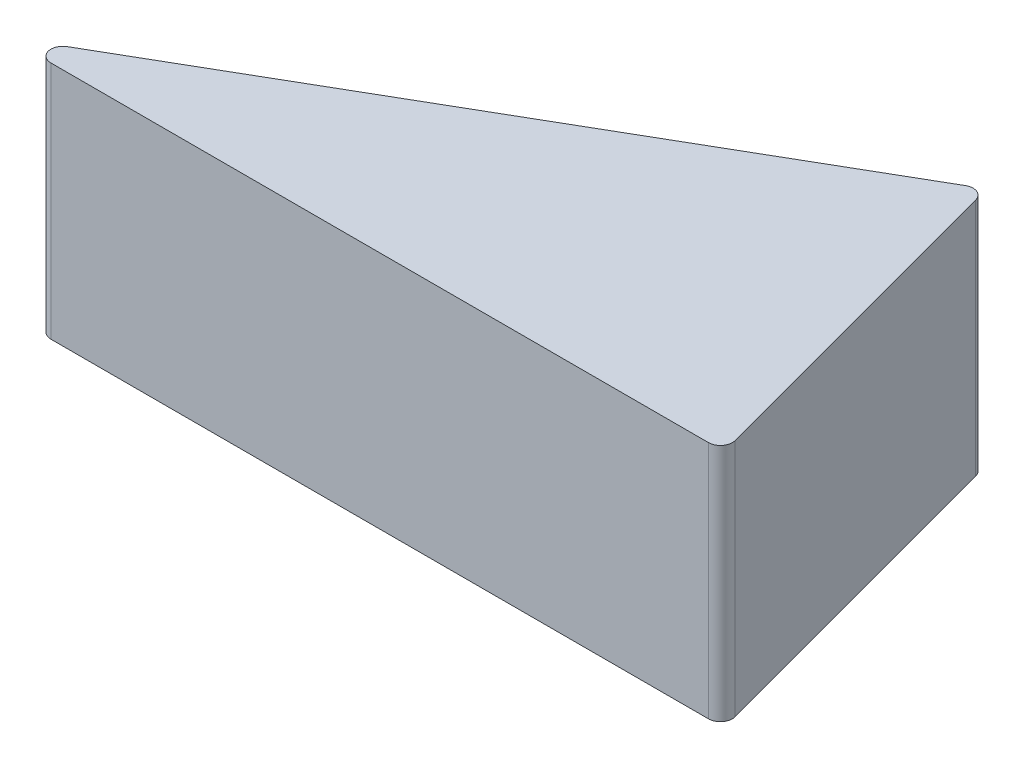
ISO-10303-21;
HEADER;
FILE_DESCRIPTION(('STEP AP214'),'2;1');
FILE_NAME('part.step','',(''),(''),'','','');
FILE_SCHEMA(('AUTOMOTIVE_DESIGN { 1 0 10303 214 1 1 1 1 }'));
ENDSEC;
DATA;
#1=APPLICATION_CONTEXT('core data for automotive mechanical design processes');
#2=APPLICATION_PROTOCOL_DEFINITION('international standard','automotive_design',2000,#1);
#3=PRODUCT_CONTEXT('',#1,'mechanical');
#4=PRODUCT('Part','Part','',(#3));
#5=PRODUCT_RELATED_PRODUCT_CATEGORY('part','',(#4));
#6=PRODUCT_DEFINITION_FORMATION('','',#4);
#7=PRODUCT_DEFINITION_CONTEXT('part definition',#1,'design');
#8=PRODUCT_DEFINITION('design','',#6,#7);
#9=PRODUCT_DEFINITION_SHAPE('','',#8);
#10=(LENGTH_UNIT() NAMED_UNIT(*) SI_UNIT(.MILLI.,.METRE.));
#11=(NAMED_UNIT(*) PLANE_ANGLE_UNIT() SI_UNIT($,.RADIAN.));
#12=(NAMED_UNIT(*) SI_UNIT($,.STERADIAN.) SOLID_ANGLE_UNIT());
#13=UNCERTAINTY_MEASURE_WITH_UNIT(LENGTH_MEASURE(1.E-05),#10,'distance_accuracy_value','');
#14=(GEOMETRIC_REPRESENTATION_CONTEXT(3) GLOBAL_UNCERTAINTY_ASSIGNED_CONTEXT((#13)) GLOBAL_UNIT_ASSIGNED_CONTEXT((#10,
#11,#12)) REPRESENTATION_CONTEXT('',''));
#15=CARTESIAN_POINT('',(0.,0.,0.));
#16=DIRECTION('',(0.,0.,1.));
#17=DIRECTION('',(1.,0.,0.));
#18=AXIS2_PLACEMENT_3D('',#15,#16,#17);
#19=CARTESIAN_POINT('',(30.,10.,0.));
#20=DIRECTION('',(-0.965925826289069,0.,0.258819045102518));
#21=DIRECTION('',(0.258819045102518,0.,0.965925826289069));
#22=AXIS2_PLACEMENT_3D('',#19,#20,#21);
#23=PLANE('',#22);
#24=DIRECTION('',(-0.258819045102518,0.,-0.965925826289069));
#25=VECTOR('',#24,1.);
#26=CARTESIAN_POINT('',(30.,10.,0.));
#27=LINE('',#26,#25);
#28=CARTESIAN_POINT('',(29.8313502267239,10.,-0.629409522551261));
#29=VERTEX_POINT('',#28);
#30=CARTESIAN_POINT('',(26.1494118868093,10.,-14.3705904774486));
#31=VERTEX_POINT('',#30);
#32=EDGE_CURVE('E112',#29,#31,#27,.T.);
#33=ORIENTED_EDGE('',*,*,#32,.F.);
#34=DIRECTION('',(0.,-1.,0.));
#35=VECTOR('',#34,1.);
#36=CARTESIAN_POINT('',(29.8313502267239,10.,-0.62940952255126));
#37=LINE('',#36,#35);
#38=CARTESIAN_POINT('',(29.8313502267239,0.,-0.629409522551261));
#39=VERTEX_POINT('',#38);
#40=EDGE_CURVE('E97',#29,#39,#37,.T.);
#41=ORIENTED_EDGE('',*,*,#40,.T.);
#42=DIRECTION('',(-0.258819045102518,0.,-0.965925826289069));
#43=VECTOR('',#42,1.);
#44=CARTESIAN_POINT('',(30.,0.,0.));
#45=LINE('',#44,#43);
#46=CARTESIAN_POINT('',(26.1494118868093,0.,-14.3705904774486));
#47=VERTEX_POINT('',#46);
#48=EDGE_CURVE('E110',#39,#47,#45,.T.);
#49=ORIENTED_EDGE('',*,*,#48,.T.);
#50=DIRECTION('',(0.,-1.,0.));
#51=VECTOR('',#50,1.);
#52=CARTESIAN_POINT('',(26.1494118868093,10.,-14.3705904774486));
#53=LINE('',#52,#51);
#54=EDGE_CURVE('E115',#47,#31,#53,.F.);
#55=ORIENTED_EDGE('',*,*,#54,.T.);
#56=EDGE_LOOP('',(#33,#41,#49,#55));
#57=FACE_BOUND('',#56,.T.);
#58=ADVANCED_FACE('F38',(#57),#23,.F.);
#59=CARTESIAN_POINT('',(25.9807621135332,10.,-14.9999999999998));
#60=DIRECTION('',(0.499999999999995,0.,0.866025403784442));
#61=DIRECTION('',(0.866025403784442,0.,-0.499999999999995));
#62=AXIS2_PLACEMENT_3D('',#59,#60,#61);
#63=PLANE('',#62);
#64=DIRECTION('',(-0.866025403784441,0.,0.499999999999995));
#65=VECTOR('',#64,1.);
#66=CARTESIAN_POINT('',(25.9807621135332,10.,-14.9999999999998));
#67=LINE('',#66,#65);
#68=CARTESIAN_POINT('',(25.4164489736648,10.,-14.6741936567895));
#69=VERTEX_POINT('',#68);
#70=CARTESIAN_POINT('',(1.61602540378447,10.,-0.933012701892224));
#71=VERTEX_POINT('',#70);
#72=EDGE_CURVE('E153',#69,#71,#67,.T.);
#73=ORIENTED_EDGE('',*,*,#72,.F.);
#74=DIRECTION('',(0.,-1.,0.));
#75=VECTOR('',#74,1.);
#76=CARTESIAN_POINT('',(25.4164489736648,10.,-14.6741936567895));
#77=LINE('',#76,#75);
#78=CARTESIAN_POINT('',(25.4164489736648,0.,-14.6741936567895));
#79=VERTEX_POINT('',#78);
#80=EDGE_CURVE('E11',#69,#79,#77,.T.);
#81=ORIENTED_EDGE('',*,*,#80,.T.);
#82=DIRECTION('',(-0.866025403784441,0.,0.499999999999995));
#83=VECTOR('',#82,1.);
#84=CARTESIAN_POINT('',(25.9807621135332,0.,-14.9999999999998));
#85=LINE('',#84,#83);
#86=CARTESIAN_POINT('',(1.61602540378447,0.,-0.933012701892224));
#87=VERTEX_POINT('',#86);
#88=EDGE_CURVE('E120',#79,#87,#85,.T.);
#89=ORIENTED_EDGE('',*,*,#88,.T.);
#90=DIRECTION('',(0.,-1.,0.));
#91=VECTOR('',#90,1.);
#92=CARTESIAN_POINT('',(1.61602540378447,10.,-0.933012701892222));
#93=LINE('',#92,#91);
#94=EDGE_CURVE('E47',#87,#71,#93,.F.);
#95=ORIENTED_EDGE('',*,*,#94,.T.);
#96=EDGE_LOOP('',(#73,#81,#89,#95));
#97=FACE_BOUND('',#96,.T.);
#98=ADVANCED_FACE('F160',(#97),#63,.F.);
#99=CARTESIAN_POINT('',(0.,10.,0.));
#100=DIRECTION('',(0.,0.,-1.));
#101=DIRECTION('',(-1.,0.,0.));
#102=AXIS2_PLACEMENT_3D('',#99,#100,#101);
#103=PLANE('',#102);
#104=DIRECTION('',(1.,0.,0.));
#105=VECTOR('',#104,1.);
#106=CARTESIAN_POINT('',(0.,0.,0.));
#107=LINE('',#106,#105);
#108=CARTESIAN_POINT('',(1.86602540378447,0.,0.));
#109=VERTEX_POINT('',#108);
#110=CARTESIAN_POINT('',(29.3483873135794,0.,0.));
#111=VERTEX_POINT('',#110);
#112=EDGE_CURVE('E123',#109,#111,#107,.T.);
#113=ORIENTED_EDGE('',*,*,#112,.T.);
#114=DIRECTION('',(0.,-1.,0.));
#115=VECTOR('',#114,1.);
#116=CARTESIAN_POINT('',(29.3483873135794,10.,0.));
#117=LINE('',#116,#115);
#118=CARTESIAN_POINT('',(29.3483873135794,10.,0.));
#119=VERTEX_POINT('',#118);
#120=EDGE_CURVE('E98',#111,#119,#117,.F.);
#121=ORIENTED_EDGE('',*,*,#120,.T.);
#122=DIRECTION('',(1.,0.,0.));
#123=VECTOR('',#122,1.);
#124=CARTESIAN_POINT('',(0.,10.,0.));
#125=LINE('',#124,#123);
#126=CARTESIAN_POINT('',(1.86602540378447,10.,0.));
#127=VERTEX_POINT('',#126);
#128=EDGE_CURVE('E126',#127,#119,#125,.T.);
#129=ORIENTED_EDGE('',*,*,#128,.F.);
#130=DIRECTION('',(0.,-1.,0.));
#131=VECTOR('',#130,1.);
#132=CARTESIAN_POINT('',(1.86602540378447,10.,0.));
#133=LINE('',#132,#131);
#134=EDGE_CURVE('E104',#127,#109,#133,.T.);
#135=ORIENTED_EDGE('',*,*,#134,.T.);
#136=EDGE_LOOP('',(#113,#121,#129,#135));
#137=FACE_BOUND('',#136,.T.);
#138=ADVANCED_FACE('F166',(#137),#103,.F.);
#139=CARTESIAN_POINT('',(0.,10.,0.));
#140=DIRECTION('',(0.,1.,0.));
#141=DIRECTION('',(0.,0.,1.));
#142=AXIS2_PLACEMENT_3D('',#139,#140,#141);
#143=PLANE('',#142);
#144=ORIENTED_EDGE('',*,*,#128,.T.);
#145=CARTESIAN_POINT('',(29.3483873135794,10.,-0.5));
#146=DIRECTION('',(0.,1.,0.));
#147=DIRECTION('',(0.,0.,1.));
#148=AXIS2_PLACEMENT_3D('',#145,#146,#147);
#149=CIRCLE('',#148,0.5);
#150=EDGE_CURVE('E147',#119,#29,#149,.T.);
#151=ORIENTED_EDGE('',*,*,#150,.T.);
#152=ORIENTED_EDGE('',*,*,#32,.T.);
#153=CARTESIAN_POINT('',(25.6664489736648,10.,-14.2411809548973));
#154=DIRECTION('',(0.,1.,0.));
#155=DIRECTION('',(0.,0.,1.));
#156=AXIS2_PLACEMENT_3D('',#153,#154,#155);
#157=CIRCLE('',#156,0.5);
#158=EDGE_CURVE('E60',#31,#69,#157,.T.);
#159=ORIENTED_EDGE('',*,*,#158,.T.);
#160=ORIENTED_EDGE('',*,*,#72,.T.);
#161=CARTESIAN_POINT('',(1.86602540378447,10.,-0.5));
#162=DIRECTION('',(0.,1.,0.));
#163=DIRECTION('',(0.,0.,1.));
#164=AXIS2_PLACEMENT_3D('',#161,#162,#163);
#165=CIRCLE('',#164,0.5);
#166=EDGE_CURVE('E142',#71,#127,#165,.T.);
#167=ORIENTED_EDGE('',*,*,#166,.T.);
#168=EDGE_LOOP('',(#144,#151,#152,#159,#160,#167));
#169=FACE_BOUND('',#168,.T.);
#170=ADVANCED_FACE('F156',(#169),#143,.T.);
#171=CARTESIAN_POINT('',(0.,0.,0.));
#172=DIRECTION('',(0.,1.,0.));
#173=DIRECTION('',(0.,0.,1.));
#174=AXIS2_PLACEMENT_3D('',#171,#172,#173);
#175=PLANE('',#174);
#176=ORIENTED_EDGE('',*,*,#48,.F.);
#177=CARTESIAN_POINT('',(29.3483873135794,0.,-0.5));
#178=DIRECTION('',(0.,1.,0.));
#179=DIRECTION('',(0.,0.,1.));
#180=AXIS2_PLACEMENT_3D('',#177,#178,#179);
#181=CIRCLE('',#180,0.5);
#182=EDGE_CURVE('E93',#39,#111,#181,.F.);
#183=ORIENTED_EDGE('',*,*,#182,.T.);
#184=ORIENTED_EDGE('',*,*,#112,.F.);
#185=CARTESIAN_POINT('',(1.86602540378447,0.,-0.5));
#186=DIRECTION('',(0.,1.,0.));
#187=DIRECTION('',(0.,0.,1.));
#188=AXIS2_PLACEMENT_3D('',#185,#186,#187);
#189=CIRCLE('',#188,0.5);
#190=EDGE_CURVE('E114',#109,#87,#189,.F.);
#191=ORIENTED_EDGE('',*,*,#190,.T.);
#192=ORIENTED_EDGE('',*,*,#88,.F.);
#193=CARTESIAN_POINT('',(25.6664489736648,0.,-14.2411809548973));
#194=DIRECTION('',(0.,1.,0.));
#195=DIRECTION('',(0.,0.,1.));
#196=AXIS2_PLACEMENT_3D('',#193,#194,#195);
#197=CIRCLE('',#196,0.5);
#198=EDGE_CURVE('E105',#79,#47,#197,.F.);
#199=ORIENTED_EDGE('',*,*,#198,.T.);
#200=EDGE_LOOP('',(#176,#183,#184,#191,#192,#199));
#201=FACE_BOUND('',#200,.T.);
#202=ADVANCED_FACE('F117',(#201),#175,.F.);
#203=CARTESIAN_POINT('',(29.3483873135794,10.,-0.5));
#204=DIRECTION('',(0.,-1.,0.));
#205=DIRECTION('',(0.,0.,-1.));
#206=AXIS2_PLACEMENT_3D('',#203,#204,#205);
#207=CYLINDRICAL_SURFACE('',#206,0.5);
#208=ORIENTED_EDGE('',*,*,#150,.F.);
#209=ORIENTED_EDGE('',*,*,#120,.F.);
#210=ORIENTED_EDGE('',*,*,#182,.F.);
#211=ORIENTED_EDGE('',*,*,#40,.F.);
#212=EDGE_LOOP('',(#208,#209,#210,#211));
#213=FACE_BOUND('',#212,.T.);
#214=ADVANCED_FACE('F96',(#213),#207,.T.);
#215=CARTESIAN_POINT('',(25.6664489736648,10.,-14.2411809548973));
#216=DIRECTION('',(0.,-1.,0.));
#217=DIRECTION('',(0.,0.,-1.));
#218=AXIS2_PLACEMENT_3D('',#215,#216,#217);
#219=CYLINDRICAL_SURFACE('',#218,0.5);
#220=ORIENTED_EDGE('',*,*,#158,.F.);
#221=ORIENTED_EDGE('',*,*,#54,.F.);
#222=ORIENTED_EDGE('',*,*,#198,.F.);
#223=ORIENTED_EDGE('',*,*,#80,.F.);
#224=EDGE_LOOP('',(#220,#221,#222,#223));
#225=FACE_BOUND('',#224,.T.);
#226=ADVANCED_FACE('F159',(#225),#219,.T.);
#227=CARTESIAN_POINT('',(1.86602540378447,10.,-0.5));
#228=DIRECTION('',(0.,-1.,0.));
#229=DIRECTION('',(0.,0.,-1.));
#230=AXIS2_PLACEMENT_3D('',#227,#228,#229);
#231=CYLINDRICAL_SURFACE('',#230,0.5);
#232=ORIENTED_EDGE('',*,*,#166,.F.);
#233=ORIENTED_EDGE('',*,*,#94,.F.);
#234=ORIENTED_EDGE('',*,*,#190,.F.);
#235=ORIENTED_EDGE('',*,*,#134,.F.);
#236=EDGE_LOOP('',(#232,#233,#234,#235));
#237=FACE_BOUND('',#236,.T.);
#238=ADVANCED_FACE('F40',(#237),#231,.T.);
#239=CLOSED_SHELL('',(#58,#98,#138,#170,#202,#214,#226,#238));
#240=MANIFOLD_SOLID_BREP('B2',#239);
#241=ADVANCED_BREP_SHAPE_REPRESENTATION('',(#18,#240),#14);
#242=SHAPE_DEFINITION_REPRESENTATION(#9,#241);
ENDSEC;
END-ISO-10303-21;
